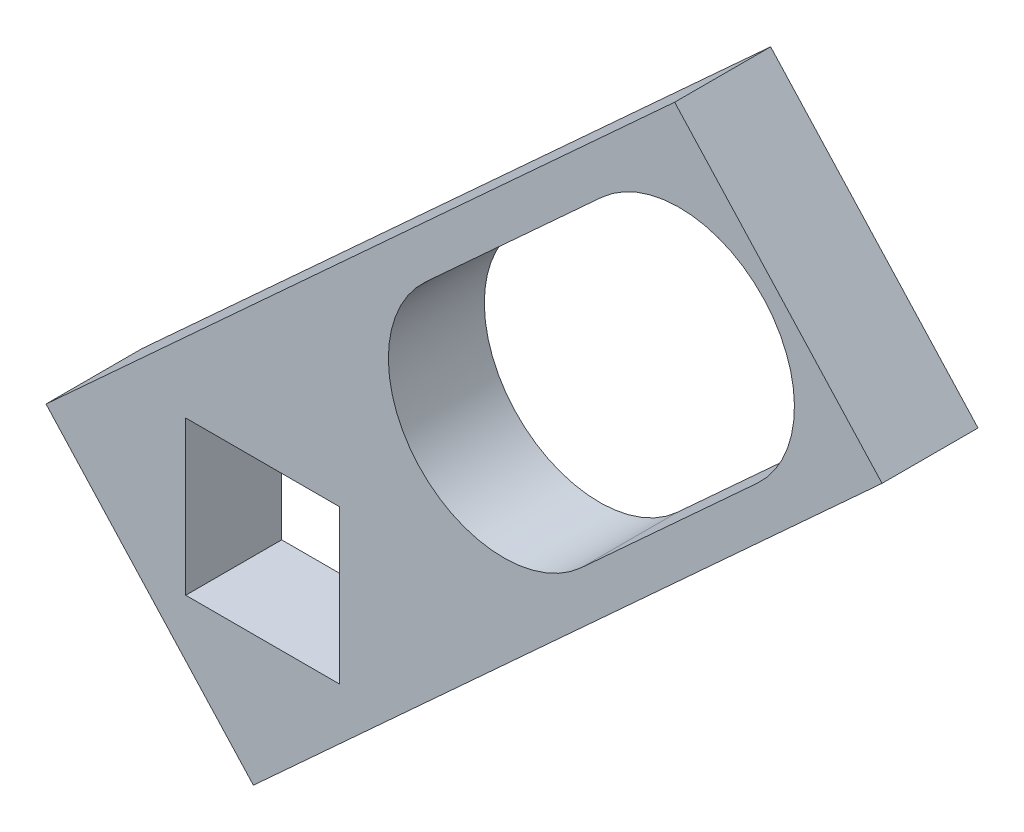
ISO-10303-21;
HEADER;
FILE_DESCRIPTION(('STEP AP214'),'2;1');
FILE_NAME('part.step','',(''),(''),'','','');
FILE_SCHEMA(('AUTOMOTIVE_DESIGN { 1 0 10303 214 1 1 1 1 }'));
ENDSEC;
DATA;
#1=APPLICATION_CONTEXT('core data for automotive mechanical design processes');
#2=APPLICATION_PROTOCOL_DEFINITION('international standard','automotive_design',2000,#1);
#3=PRODUCT_CONTEXT('',#1,'mechanical');
#4=PRODUCT('Part','Part','',(#3));
#5=PRODUCT_RELATED_PRODUCT_CATEGORY('part','',(#4));
#6=PRODUCT_DEFINITION_FORMATION('','',#4);
#7=PRODUCT_DEFINITION_CONTEXT('part definition',#1,'design');
#8=PRODUCT_DEFINITION('design','',#6,#7);
#9=PRODUCT_DEFINITION_SHAPE('','',#8);
#10=(LENGTH_UNIT() NAMED_UNIT(*) SI_UNIT(.MILLI.,.METRE.));
#11=(NAMED_UNIT(*) PLANE_ANGLE_UNIT() SI_UNIT($,.RADIAN.));
#12=(NAMED_UNIT(*) SI_UNIT($,.STERADIAN.) SOLID_ANGLE_UNIT());
#13=UNCERTAINTY_MEASURE_WITH_UNIT(LENGTH_MEASURE(1.E-05),#10,'distance_accuracy_value','');
#14=(GEOMETRIC_REPRESENTATION_CONTEXT(3) GLOBAL_UNCERTAINTY_ASSIGNED_CONTEXT((#13)) GLOBAL_UNIT_ASSIGNED_CONTEXT((#10,
#11,#12)) REPRESENTATION_CONTEXT('',''));
#15=CARTESIAN_POINT('',(0.,0.,0.));
#16=DIRECTION('',(0.,0.,1.));
#17=DIRECTION('',(1.,0.,0.));
#18=AXIS2_PLACEMENT_3D('',#15,#16,#17);
#19=CARTESIAN_POINT('',(0.,0.,2.5));
#20=DIRECTION('',(-0.73747772760734,-0.675371454299865,0.));
#21=DIRECTION('',(0.675371454299865,-0.73747772760734,0.));
#22=AXIS2_PLACEMENT_3D('',#19,#20,#21);
#23=PLANE('',#22);
#24=DIRECTION('',(-0.675371454299865,0.73747772760734,0.));
#25=VECTOR('',#24,1.);
#26=CARTESIAN_POINT('',(0.,0.,0.));
#27=LINE('',#26,#25);
#28=CARTESIAN_POINT('',(0.,0.,0.));
#29=VERTEX_POINT('',#28);
#30=CARTESIAN_POINT('',(-5.40297163439892,5.89982182085872,0.));
#31=VERTEX_POINT('',#30);
#32=EDGE_CURVE('E212',#29,#31,#27,.T.);
#33=ORIENTED_EDGE('',*,*,#32,.F.);
#34=DIRECTION('',(0.,0.,-1.));
#35=VECTOR('',#34,1.);
#36=CARTESIAN_POINT('',(0.,0.,2.5));
#37=LINE('',#36,#35);
#38=CARTESIAN_POINT('',(0.,0.,2.5));
#39=VERTEX_POINT('',#38);
#40=EDGE_CURVE('E11',#39,#29,#37,.T.);
#41=ORIENTED_EDGE('',*,*,#40,.F.);
#42=DIRECTION('',(-0.675371454299865,0.73747772760734,0.));
#43=VECTOR('',#42,1.);
#44=CARTESIAN_POINT('',(0.,0.,2.5));
#45=LINE('',#44,#43);
#46=CARTESIAN_POINT('',(-5.40297163439892,5.89982182085872,2.5));
#47=VERTEX_POINT('',#46);
#48=EDGE_CURVE('E222',#39,#47,#45,.T.);
#49=ORIENTED_EDGE('',*,*,#48,.T.);
#50=DIRECTION('',(0.,0.,-1.));
#51=VECTOR('',#50,1.);
#52=CARTESIAN_POINT('',(-5.40297163439892,5.89982182085872,2.5));
#53=LINE('',#52,#51);
#54=EDGE_CURVE('E42',#47,#31,#53,.T.);
#55=ORIENTED_EDGE('',*,*,#54,.T.);
#56=EDGE_LOOP('',(#33,#41,#49,#55));
#57=FACE_BOUND('',#56,.T.);
#58=ADVANCED_FACE('F39',(#57),#23,.T.);
#59=CARTESIAN_POINT('',(0.,0.,2.5));
#60=DIRECTION('',(-0.675371454299865,0.73747772760734,0.));
#61=DIRECTION('',(-0.73747772760734,-0.675371454299865,0.));
#62=AXIS2_PLACEMENT_3D('',#59,#60,#61);
#63=PLANE('',#62);
#64=DIRECTION('',(0.73747772760734,0.675371454299865,0.));
#65=VECTOR('',#64,1.);
#66=CARTESIAN_POINT('',(0.,0.,0.));
#67=LINE('',#66,#65);
#68=CARTESIAN_POINT('',(16.379380330159,15.,0.));
#69=VERTEX_POINT('',#68);
#70=EDGE_CURVE('E227',#29,#69,#67,.T.);
#71=ORIENTED_EDGE('',*,*,#70,.T.);
#72=DIRECTION('',(0.,0.,-1.));
#73=VECTOR('',#72,1.);
#74=CARTESIAN_POINT('',(16.379380330159,15.,2.5));
#75=LINE('',#74,#73);
#76=CARTESIAN_POINT('',(16.379380330159,15.,2.5));
#77=VERTEX_POINT('',#76);
#78=EDGE_CURVE('E48',#77,#69,#75,.T.);
#79=ORIENTED_EDGE('',*,*,#78,.F.);
#80=DIRECTION('',(0.73747772760734,0.675371454299865,0.));
#81=VECTOR('',#80,1.);
#82=CARTESIAN_POINT('',(0.,0.,2.5));
#83=LINE('',#82,#81);
#84=EDGE_CURVE('E234',#39,#77,#83,.T.);
#85=ORIENTED_EDGE('',*,*,#84,.F.);
#86=ORIENTED_EDGE('',*,*,#40,.T.);
#87=EDGE_LOOP('',(#71,#79,#85,#86));
#88=FACE_BOUND('',#87,.T.);
#89=ADVANCED_FACE('F268',(#88),#63,.F.);
#90=CARTESIAN_POINT('',(16.379380330159,15.,2.5));
#91=DIRECTION('',(-0.73747772760734,-0.675371454299865,0.));
#92=DIRECTION('',(0.675371454299865,-0.73747772760734,0.));
#93=AXIS2_PLACEMENT_3D('',#90,#91,#92);
#94=PLANE('',#93);
#95=DIRECTION('',(-0.675371454299865,0.73747772760734,0.));
#96=VECTOR('',#95,1.);
#97=CARTESIAN_POINT('',(16.379380330159,15.,0.));
#98=LINE('',#97,#96);
#99=CARTESIAN_POINT('',(10.9764086957601,20.8998218208587,0.));
#100=VERTEX_POINT('',#99);
#101=EDGE_CURVE('E244',#69,#100,#98,.T.);
#102=ORIENTED_EDGE('',*,*,#101,.T.);
#103=DIRECTION('',(0.,0.,-1.));
#104=VECTOR('',#103,1.);
#105=CARTESIAN_POINT('',(10.9764086957601,20.8998218208587,2.5));
#106=LINE('',#105,#104);
#107=CARTESIAN_POINT('',(10.9764086957601,20.8998218208587,2.5));
#108=VERTEX_POINT('',#107);
#109=EDGE_CURVE('E252',#108,#100,#106,.T.);
#110=ORIENTED_EDGE('',*,*,#109,.F.);
#111=DIRECTION('',(-0.675371454299865,0.73747772760734,0.));
#112=VECTOR('',#111,1.);
#113=CARTESIAN_POINT('',(16.379380330159,15.,2.5));
#114=LINE('',#113,#112);
#115=EDGE_CURVE('E231',#77,#108,#114,.T.);
#116=ORIENTED_EDGE('',*,*,#115,.F.);
#117=ORIENTED_EDGE('',*,*,#78,.T.);
#118=EDGE_LOOP('',(#102,#110,#116,#117));
#119=FACE_BOUND('',#118,.T.);
#120=ADVANCED_FACE('F272',(#119),#94,.F.);
#121=CARTESIAN_POINT('',(-5.40297163439892,5.89982182085872,2.5));
#122=DIRECTION('',(-0.675371454299865,0.73747772760734,0.));
#123=DIRECTION('',(-0.73747772760734,-0.675371454299865,0.));
#124=AXIS2_PLACEMENT_3D('',#121,#122,#123);
#125=PLANE('',#124);
#126=DIRECTION('',(0.73747772760734,0.675371454299865,0.));
#127=VECTOR('',#126,1.);
#128=CARTESIAN_POINT('',(-5.40297163439892,5.89982182085872,0.));
#129=LINE('',#128,#127);
#130=EDGE_CURVE('E240',#31,#100,#129,.T.);
#131=ORIENTED_EDGE('',*,*,#130,.F.);
#132=ORIENTED_EDGE('',*,*,#54,.F.);
#133=DIRECTION('',(0.73747772760734,0.675371454299865,0.));
#134=VECTOR('',#133,1.);
#135=CARTESIAN_POINT('',(-5.40297163439892,5.89982182085872,2.5));
#136=LINE('',#135,#134);
#137=EDGE_CURVE('E226',#47,#108,#136,.T.);
#138=ORIENTED_EDGE('',*,*,#137,.T.);
#139=ORIENTED_EDGE('',*,*,#109,.T.);
#140=EDGE_LOOP('',(#131,#132,#138,#139));
#141=FACE_BOUND('',#140,.T.);
#142=ADVANCED_FACE('F262',(#141),#125,.T.);
#143=CARTESIAN_POINT('',(0.,0.,2.5));
#144=DIRECTION('',(0.,0.,-1.));
#145=DIRECTION('',(-1.,0.,0.));
#146=AXIS2_PLACEMENT_3D('',#143,#144,#145);
#147=PLANE('',#146);
#148=DIRECTION('',(-0.737477727607344,-0.67537145429986,0.));
#149=VECTOR('',#148,1.);
#150=CARTESIAN_POINT('',(9.07060810343429,17.7985440032019,2.5));
#151=LINE('',#150,#149);
#152=CARTESIAN_POINT('',(9.07060810343429,17.7985440032019,2.5));
#153=VERTEX_POINT('',#152);
#154=CARTESIAN_POINT('',(4.49087141499268,13.6044872719997,2.5));
#155=VERTEX_POINT('',#154);
#156=EDGE_CURVE('E163',#153,#155,#151,.T.);
#157=ORIENTED_EDGE('',*,*,#156,.F.);
#158=CARTESIAN_POINT('',(11.0967224663339,15.5861108203798,2.5));
#159=DIRECTION('',(0.,0.,1.));
#160=DIRECTION('',(1.,0.,0.));
#161=AXIS2_PLACEMENT_3D('',#158,#159,#160);
#162=CIRCLE('',#161,3.);
#163=CARTESIAN_POINT('',(13.1228368292334,13.3736776375578,2.5));
#164=VERTEX_POINT('',#163);
#165=EDGE_CURVE('E56',#164,#153,#162,.T.);
#166=ORIENTED_EDGE('',*,*,#165,.F.);
#167=DIRECTION('',(0.737477727607345,0.67537145429986,0.));
#168=VECTOR('',#167,1.);
#169=CARTESIAN_POINT('',(13.1228368292334,13.3736776375578,2.5));
#170=LINE('',#169,#168);
#171=CARTESIAN_POINT('',(8.54310014079184,9.17962090635567,2.5));
#172=VERTEX_POINT('',#171);
#173=EDGE_CURVE('E150',#172,#164,#170,.T.);
#174=ORIENTED_EDGE('',*,*,#173,.F.);
#175=CARTESIAN_POINT('',(6.51698577789226,11.3920540891777,2.5));
#176=DIRECTION('',(0.,0.,1.));
#177=DIRECTION('',(1.,0.,0.));
#178=AXIS2_PLACEMENT_3D('',#175,#176,#177);
#179=CIRCLE('',#178,3.);
#180=EDGE_CURVE('E154',#155,#172,#179,.T.);
#181=ORIENTED_EDGE('',*,*,#180,.F.);
#182=EDGE_LOOP('',(#157,#166,#174,#181));
#183=FACE_BOUND('',#182,.T.);
#184=DIRECTION('',(1.,0.,0.));
#185=VECTOR('',#184,1.);
#186=CARTESIAN_POINT('',(-1.76240013182498,3.40513480353892,2.5));
#187=LINE('',#186,#185);
#188=CARTESIAN_POINT('',(-1.76240013182498,3.40513480353892,2.5));
#189=VERTEX_POINT('',#188);
#190=CARTESIAN_POINT('',(2.23759986817502,3.40513480353892,2.5));
#191=VERTEX_POINT('',#190);
#192=EDGE_CURVE('E198',#189,#191,#187,.T.);
#193=ORIENTED_EDGE('',*,*,#192,.F.);
#194=DIRECTION('',(0.,-1.,0.));
#195=VECTOR('',#194,1.);
#196=CARTESIAN_POINT('',(-1.76240013182498,7.40513480353892,2.5));
#197=LINE('',#196,#195);
#198=CARTESIAN_POINT('',(-1.76240013182498,7.40513480353892,2.5));
#199=VERTEX_POINT('',#198);
#200=EDGE_CURVE('E172',#199,#189,#197,.T.);
#201=ORIENTED_EDGE('',*,*,#200,.F.);
#202=DIRECTION('',(-1.,0.,0.));
#203=VECTOR('',#202,1.);
#204=CARTESIAN_POINT('',(-1.76240013182498,7.40513480353892,2.5));
#205=LINE('',#204,#203);
#206=CARTESIAN_POINT('',(2.23759986817502,7.40513480353892,2.5));
#207=VERTEX_POINT('',#206);
#208=EDGE_CURVE('E183',#207,#199,#205,.T.);
#209=ORIENTED_EDGE('',*,*,#208,.F.);
#210=DIRECTION('',(0.,1.,0.));
#211=VECTOR('',#210,1.);
#212=CARTESIAN_POINT('',(2.23759986817502,7.40513480353892,2.5));
#213=LINE('',#212,#211);
#214=EDGE_CURVE('E202',#191,#207,#213,.T.);
#215=ORIENTED_EDGE('',*,*,#214,.F.);
#216=EDGE_LOOP('',(#193,#201,#209,#215));
#217=FACE_BOUND('',#216,.T.);
#218=ORIENTED_EDGE('',*,*,#48,.F.);
#219=ORIENTED_EDGE('',*,*,#84,.T.);
#220=ORIENTED_EDGE('',*,*,#115,.T.);
#221=ORIENTED_EDGE('',*,*,#137,.F.);
#222=EDGE_LOOP('',(#218,#219,#220,#221));
#223=FACE_BOUND('',#222,.T.);
#224=ADVANCED_FACE('F274',(#183,#217,#223),#147,.F.);
#225=CARTESIAN_POINT('',(0.,0.,0.));
#226=DIRECTION('',(0.,0.,-1.));
#227=DIRECTION('',(-1.,0.,0.));
#228=AXIS2_PLACEMENT_3D('',#225,#226,#227);
#229=PLANE('',#228);
#230=CARTESIAN_POINT('',(11.0967224663339,15.5861108203798,0.));
#231=DIRECTION('',(0.,0.,1.));
#232=DIRECTION('',(1.,0.,0.));
#233=AXIS2_PLACEMENT_3D('',#230,#231,#232);
#234=CIRCLE('',#233,3.);
#235=CARTESIAN_POINT('',(13.1228368292334,13.3736776375578,0.));
#236=VERTEX_POINT('',#235);
#237=CARTESIAN_POINT('',(9.07060810343429,17.7985440032019,0.));
#238=VERTEX_POINT('',#237);
#239=EDGE_CURVE('E131',#236,#238,#234,.T.);
#240=ORIENTED_EDGE('',*,*,#239,.T.);
#241=DIRECTION('',(-0.737477727607344,-0.67537145429986,0.));
#242=VECTOR('',#241,1.);
#243=CARTESIAN_POINT('',(9.07060810343429,17.7985440032019,0.));
#244=LINE('',#243,#242);
#245=CARTESIAN_POINT('',(4.49087141499268,13.6044872719997,0.));
#246=VERTEX_POINT('',#245);
#247=EDGE_CURVE('E141',#238,#246,#244,.T.);
#248=ORIENTED_EDGE('',*,*,#247,.T.);
#249=CARTESIAN_POINT('',(6.51698577789226,11.3920540891777,0.));
#250=DIRECTION('',(0.,0.,1.));
#251=DIRECTION('',(1.,0.,0.));
#252=AXIS2_PLACEMENT_3D('',#249,#250,#251);
#253=CIRCLE('',#252,3.);
#254=CARTESIAN_POINT('',(8.54310014079184,9.17962090635567,0.));
#255=VERTEX_POINT('',#254);
#256=EDGE_CURVE('E64',#246,#255,#253,.T.);
#257=ORIENTED_EDGE('',*,*,#256,.T.);
#258=DIRECTION('',(0.737477727607345,0.67537145429986,0.));
#259=VECTOR('',#258,1.);
#260=CARTESIAN_POINT('',(13.1228368292334,13.3736776375578,0.));
#261=LINE('',#260,#259);
#262=EDGE_CURVE('E138',#255,#236,#261,.T.);
#263=ORIENTED_EDGE('',*,*,#262,.T.);
#264=EDGE_LOOP('',(#240,#248,#257,#263));
#265=FACE_BOUND('',#264,.T.);
#266=DIRECTION('',(0.,-1.,0.));
#267=VECTOR('',#266,1.);
#268=CARTESIAN_POINT('',(-1.76240013182498,7.40513480353892,0.));
#269=LINE('',#268,#267);
#270=CARTESIAN_POINT('',(-1.76240013182498,7.40513480353892,0.));
#271=VERTEX_POINT('',#270);
#272=CARTESIAN_POINT('',(-1.76240013182498,3.40513480353892,0.));
#273=VERTEX_POINT('',#272);
#274=EDGE_CURVE('E178',#271,#273,#269,.T.);
#275=ORIENTED_EDGE('',*,*,#274,.T.);
#276=DIRECTION('',(1.,0.,0.));
#277=VECTOR('',#276,1.);
#278=CARTESIAN_POINT('',(-1.76240013182498,3.40513480353892,0.));
#279=LINE('',#278,#277);
#280=CARTESIAN_POINT('',(2.23759986817502,3.40513480353892,0.));
#281=VERTEX_POINT('',#280);
#282=EDGE_CURVE('E182',#273,#281,#279,.T.);
#283=ORIENTED_EDGE('',*,*,#282,.T.);
#284=DIRECTION('',(0.,1.,0.));
#285=VECTOR('',#284,1.);
#286=CARTESIAN_POINT('',(2.23759986817502,7.40513480353892,0.));
#287=LINE('',#286,#285);
#288=CARTESIAN_POINT('',(2.23759986817502,7.40513480353892,0.));
#289=VERTEX_POINT('',#288);
#290=EDGE_CURVE('E187',#281,#289,#287,.T.);
#291=ORIENTED_EDGE('',*,*,#290,.T.);
#292=DIRECTION('',(-1.,0.,0.));
#293=VECTOR('',#292,1.);
#294=CARTESIAN_POINT('',(-1.76240013182498,7.40513480353892,0.));
#295=LINE('',#294,#293);
#296=EDGE_CURVE('E191',#289,#271,#295,.T.);
#297=ORIENTED_EDGE('',*,*,#296,.T.);
#298=EDGE_LOOP('',(#275,#283,#291,#297));
#299=FACE_BOUND('',#298,.T.);
#300=ORIENTED_EDGE('',*,*,#32,.T.);
#301=ORIENTED_EDGE('',*,*,#130,.T.);
#302=ORIENTED_EDGE('',*,*,#101,.F.);
#303=ORIENTED_EDGE('',*,*,#70,.F.);
#304=EDGE_LOOP('',(#300,#301,#302,#303));
#305=FACE_BOUND('',#304,.T.);
#306=ADVANCED_FACE('F146',(#265,#299,#305),#229,.T.);
#307=CARTESIAN_POINT('',(-1.76240013182498,7.40513480353892,0.));
#308=DIRECTION('',(-1.,0.,0.));
#309=DIRECTION('',(0.,-1.,0.));
#310=AXIS2_PLACEMENT_3D('',#307,#308,#309);
#311=PLANE('',#310);
#312=ORIENTED_EDGE('',*,*,#200,.T.);
#313=DIRECTION('',(0.,0.,1.));
#314=VECTOR('',#313,1.);
#315=CARTESIAN_POINT('',(-1.76240013182498,3.40513480353892,0.));
#316=LINE('',#315,#314);
#317=EDGE_CURVE('E195',#273,#189,#316,.T.);
#318=ORIENTED_EDGE('',*,*,#317,.F.);
#319=ORIENTED_EDGE('',*,*,#274,.F.);
#320=DIRECTION('',(0.,0.,1.));
#321=VECTOR('',#320,1.);
#322=CARTESIAN_POINT('',(-1.76240013182498,7.40513480353892,0.));
#323=LINE('',#322,#321);
#324=EDGE_CURVE('E209',#271,#199,#323,.T.);
#325=ORIENTED_EDGE('',*,*,#324,.T.);
#326=EDGE_LOOP('',(#312,#318,#319,#325));
#327=FACE_BOUND('',#326,.T.);
#328=ADVANCED_FACE('F282',(#327),#311,.F.);
#329=CARTESIAN_POINT('',(-1.76240013182498,7.40513480353892,0.));
#330=DIRECTION('',(0.,1.,0.));
#331=DIRECTION('',(0.,0.,1.));
#332=AXIS2_PLACEMENT_3D('',#329,#330,#331);
#333=PLANE('',#332);
#334=ORIENTED_EDGE('',*,*,#208,.T.);
#335=ORIENTED_EDGE('',*,*,#324,.F.);
#336=ORIENTED_EDGE('',*,*,#296,.F.);
#337=DIRECTION('',(0.,0.,1.));
#338=VECTOR('',#337,1.);
#339=CARTESIAN_POINT('',(2.23759986817502,7.40513480353892,0.));
#340=LINE('',#339,#338);
#341=EDGE_CURVE('E213',#289,#207,#340,.T.);
#342=ORIENTED_EDGE('',*,*,#341,.T.);
#343=EDGE_LOOP('',(#334,#335,#336,#342));
#344=FACE_BOUND('',#343,.T.);
#345=ADVANCED_FACE('F311',(#344),#333,.F.);
#346=CARTESIAN_POINT('',(2.23759986817502,7.40513480353892,0.));
#347=DIRECTION('',(1.,0.,0.));
#348=DIRECTION('',(0.,1.,0.));
#349=AXIS2_PLACEMENT_3D('',#346,#347,#348);
#350=PLANE('',#349);
#351=ORIENTED_EDGE('',*,*,#214,.T.);
#352=ORIENTED_EDGE('',*,*,#341,.F.);
#353=ORIENTED_EDGE('',*,*,#290,.F.);
#354=DIRECTION('',(0.,0.,1.));
#355=VECTOR('',#354,1.);
#356=CARTESIAN_POINT('',(2.23759986817502,3.40513480353892,0.));
#357=LINE('',#356,#355);
#358=EDGE_CURVE('E216',#281,#191,#357,.T.);
#359=ORIENTED_EDGE('',*,*,#358,.T.);
#360=EDGE_LOOP('',(#351,#352,#353,#359));
#361=FACE_BOUND('',#360,.T.);
#362=ADVANCED_FACE('F321',(#361),#350,.F.);
#363=CARTESIAN_POINT('',(-1.76240013182498,3.40513480353892,0.));
#364=DIRECTION('',(0.,-1.,0.));
#365=DIRECTION('',(0.,0.,-1.));
#366=AXIS2_PLACEMENT_3D('',#363,#364,#365);
#367=PLANE('',#366);
#368=ORIENTED_EDGE('',*,*,#192,.T.);
#369=ORIENTED_EDGE('',*,*,#358,.F.);
#370=ORIENTED_EDGE('',*,*,#282,.F.);
#371=ORIENTED_EDGE('',*,*,#317,.T.);
#372=EDGE_LOOP('',(#368,#369,#370,#371));
#373=FACE_BOUND('',#372,.T.);
#374=ADVANCED_FACE('F331',(#373),#367,.F.);
#375=CARTESIAN_POINT('',(11.0967224663339,15.5861108203798,0.));
#376=DIRECTION('',(0.,0.,1.));
#377=DIRECTION('',(1.,0.,0.));
#378=AXIS2_PLACEMENT_3D('',#375,#376,#377);
#379=CYLINDRICAL_SURFACE('',#378,3.);
#380=ORIENTED_EDGE('',*,*,#165,.T.);
#381=DIRECTION('',(0.,0.,1.));
#382=VECTOR('',#381,1.);
#383=CARTESIAN_POINT('',(9.07060810343429,17.7985440032019,0.));
#384=LINE('',#383,#382);
#385=EDGE_CURVE('E127',#238,#153,#384,.T.);
#386=ORIENTED_EDGE('',*,*,#385,.F.);
#387=ORIENTED_EDGE('',*,*,#239,.F.);
#388=DIRECTION('',(0.,0.,1.));
#389=VECTOR('',#388,1.);
#390=CARTESIAN_POINT('',(13.1228368292334,13.3736776375578,0.));
#391=LINE('',#390,#389);
#392=EDGE_CURVE('E169',#236,#164,#391,.T.);
#393=ORIENTED_EDGE('',*,*,#392,.T.);
#394=EDGE_LOOP('',(#380,#386,#387,#393));
#395=FACE_BOUND('',#394,.T.);
#396=ADVANCED_FACE('F129',(#395),#379,.F.);
#397=CARTESIAN_POINT('',(13.1228368292334,13.3736776375578,0.));
#398=DIRECTION('',(0.67537145429986,-0.737477727607345,0.));
#399=DIRECTION('',(0.737477727607345,0.67537145429986,0.));
#400=AXIS2_PLACEMENT_3D('',#397,#398,#399);
#401=PLANE('',#400);
#402=ORIENTED_EDGE('',*,*,#173,.T.);
#403=ORIENTED_EDGE('',*,*,#392,.F.);
#404=ORIENTED_EDGE('',*,*,#262,.F.);
#405=DIRECTION('',(0.,0.,1.));
#406=VECTOR('',#405,1.);
#407=CARTESIAN_POINT('',(8.54310014079184,9.17962090635567,0.));
#408=LINE('',#407,#406);
#409=EDGE_CURVE('E173',#255,#172,#408,.T.);
#410=ORIENTED_EDGE('',*,*,#409,.T.);
#411=EDGE_LOOP('',(#402,#403,#404,#410));
#412=FACE_BOUND('',#411,.T.);
#413=ADVANCED_FACE('F358',(#412),#401,.F.);
#414=CARTESIAN_POINT('',(6.51698577789226,11.3920540891777,0.));
#415=DIRECTION('',(0.,0.,1.));
#416=DIRECTION('',(1.,0.,0.));
#417=AXIS2_PLACEMENT_3D('',#414,#415,#416);
#418=CYLINDRICAL_SURFACE('',#417,3.);
#419=ORIENTED_EDGE('',*,*,#180,.T.);
#420=ORIENTED_EDGE('',*,*,#409,.F.);
#421=ORIENTED_EDGE('',*,*,#256,.F.);
#422=DIRECTION('',(0.,0.,1.));
#423=VECTOR('',#422,1.);
#424=CARTESIAN_POINT('',(4.49087141499268,13.6044872719997,0.));
#425=LINE('',#424,#423);
#426=EDGE_CURVE('E137',#246,#155,#425,.T.);
#427=ORIENTED_EDGE('',*,*,#426,.T.);
#428=EDGE_LOOP('',(#419,#420,#421,#427));
#429=FACE_BOUND('',#428,.T.);
#430=ADVANCED_FACE('F367',(#429),#418,.F.);
#431=CARTESIAN_POINT('',(9.07060810343429,17.7985440032019,0.));
#432=DIRECTION('',(-0.67537145429986,0.737477727607344,0.));
#433=DIRECTION('',(-0.737477727607344,-0.67537145429986,0.));
#434=AXIS2_PLACEMENT_3D('',#431,#432,#433);
#435=PLANE('',#434);
#436=ORIENTED_EDGE('',*,*,#156,.T.);
#437=ORIENTED_EDGE('',*,*,#426,.F.);
#438=ORIENTED_EDGE('',*,*,#247,.F.);
#439=ORIENTED_EDGE('',*,*,#385,.T.);
#440=EDGE_LOOP('',(#436,#437,#438,#439));
#441=FACE_BOUND('',#440,.T.);
#442=ADVANCED_FACE('F142',(#441),#435,.F.);
#443=CLOSED_SHELL('',(#58,#89,#120,#142,#224,#306,#328,#345,#362,#374,#396,#413,#430,#442));
#444=MANIFOLD_SOLID_BREP('B2',#443);
#445=ADVANCED_BREP_SHAPE_REPRESENTATION('',(#18,#444),#14);
#446=SHAPE_DEFINITION_REPRESENTATION(#9,#445);
ENDSEC;
END-ISO-10303-21;
